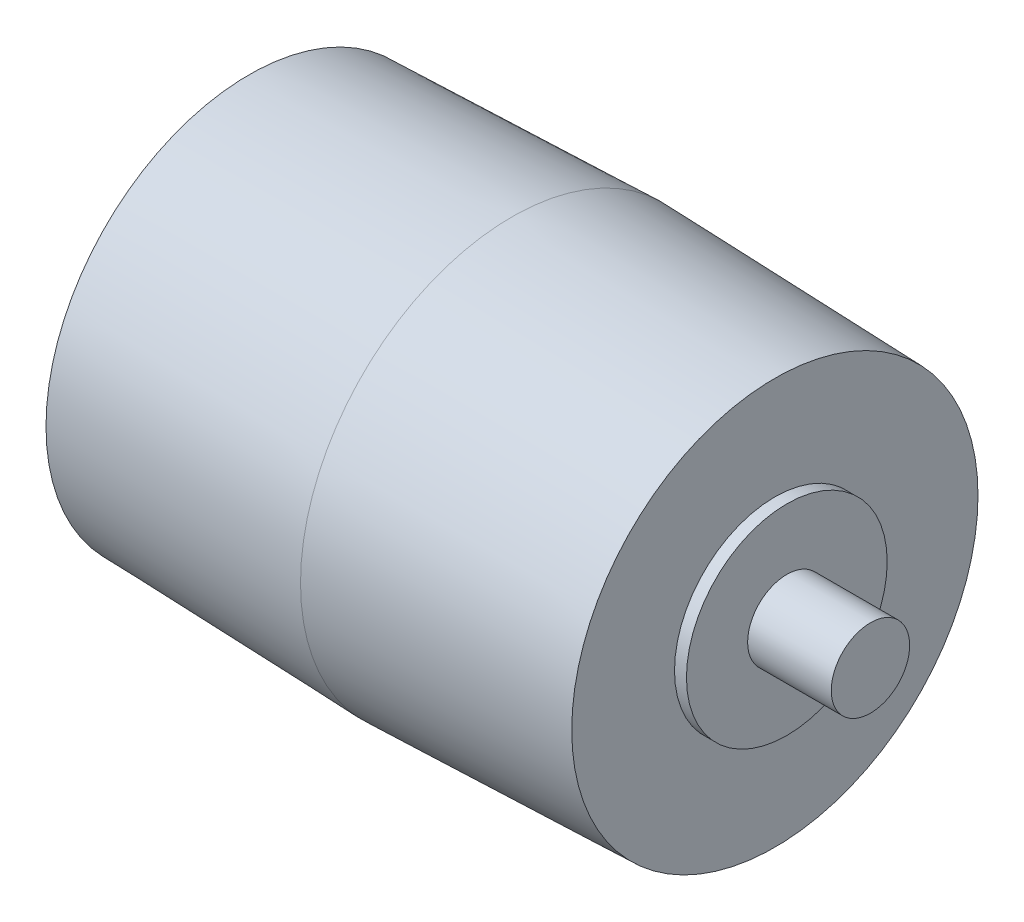
ISO-10303-21;
HEADER;
FILE_DESCRIPTION(('STEP AP214'),'2;1');
FILE_NAME('part.step','',(''),(''),'','','');
FILE_SCHEMA(('AUTOMOTIVE_DESIGN { 1 0 10303 214 1 1 1 1 }'));
ENDSEC;
DATA;
#1=APPLICATION_CONTEXT('core data for automotive mechanical design processes');
#2=APPLICATION_PROTOCOL_DEFINITION('international standard','automotive_design',2000,#1);
#3=PRODUCT_CONTEXT('',#1,'mechanical');
#4=PRODUCT('Part','Part','',(#3));
#5=PRODUCT_RELATED_PRODUCT_CATEGORY('part','',(#4));
#6=PRODUCT_DEFINITION_FORMATION('','',#4);
#7=PRODUCT_DEFINITION_CONTEXT('part definition',#1,'design');
#8=PRODUCT_DEFINITION('design','',#6,#7);
#9=PRODUCT_DEFINITION_SHAPE('','',#8);
#10=(LENGTH_UNIT() NAMED_UNIT(*) SI_UNIT(.MILLI.,.METRE.));
#11=(NAMED_UNIT(*) PLANE_ANGLE_UNIT() SI_UNIT($,.RADIAN.));
#12=(NAMED_UNIT(*) SI_UNIT($,.STERADIAN.) SOLID_ANGLE_UNIT());
#13=UNCERTAINTY_MEASURE_WITH_UNIT(LENGTH_MEASURE(1.E-05),#10,'distance_accuracy_value','');
#14=(GEOMETRIC_REPRESENTATION_CONTEXT(3) GLOBAL_UNCERTAINTY_ASSIGNED_CONTEXT((#13)) GLOBAL_UNIT_ASSIGNED_CONTEXT((#10,
#11,#12)) REPRESENTATION_CONTEXT('',''));
#15=CARTESIAN_POINT('',(0.,0.,0.));
#16=DIRECTION('',(0.,0.,1.));
#17=DIRECTION('',(1.,0.,0.));
#18=AXIS2_PLACEMENT_3D('',#15,#16,#17);
#19=CARTESIAN_POINT('',(9.525,0.,0.));
#20=DIRECTION('',(-1.,0.,0.));
#21=DIRECTION('',(0.,0.,1.));
#22=AXIS2_PLACEMENT_3D('',#19,#20,#21);
#23=PLANE('',#22);
#24=CARTESIAN_POINT('',(9.525,0.,0.));
#25=DIRECTION('',(-1.,0.,0.));
#26=DIRECTION('',(0.,0.,1.));
#27=AXIS2_PLACEMENT_3D('',#24,#25,#26);
#28=CIRCLE('',#27,1.0414);
#29=CARTESIAN_POINT('',(9.525,0.,1.0414));
#30=VERTEX_POINT('',#29);
#31=EDGE_CURVE('E10',#30,#30,#28,.T.);
#32=ORIENTED_EDGE('',*,*,#31,.F.);
#33=EDGE_LOOP('',(#32));
#34=FACE_BOUND('',#33,.T.);
#35=ADVANCED_FACE('F37',(#34),#23,.F.);
#36=CARTESIAN_POINT('',(-9.525,0.,0.));
#37=DIRECTION('',(-1.,0.,0.));
#38=DIRECTION('',(0.,0.,1.));
#39=AXIS2_PLACEMENT_3D('',#36,#37,#38);
#40=CYLINDRICAL_SURFACE('',#39,1.0414);
#41=CARTESIAN_POINT('',(7.3025,0.,0.));
#42=DIRECTION('',(-1.,0.,0.));
#43=DIRECTION('',(0.,0.,1.));
#44=AXIS2_PLACEMENT_3D('',#41,#42,#43);
#45=CIRCLE('',#44,1.0414);
#46=CARTESIAN_POINT('',(7.3025,0.,1.0414));
#47=VERTEX_POINT('',#46);
#48=EDGE_CURVE('E43',#47,#47,#45,.T.);
#49=ORIENTED_EDGE('',*,*,#48,.F.);
#50=EDGE_LOOP('',(#49));
#51=FACE_BOUND('',#50,.T.);
#52=ORIENTED_EDGE('',*,*,#31,.T.);
#53=EDGE_LOOP('',(#52));
#54=FACE_BOUND('',#53,.T.);
#55=ADVANCED_FACE('F130',(#51,#54),#40,.T.);
#56=CARTESIAN_POINT('',(7.3025,1.0414,0.));
#57=DIRECTION('',(-1.,0.,0.));
#58=DIRECTION('',(0.,0.,1.));
#59=AXIS2_PLACEMENT_3D('',#56,#57,#58);
#60=PLANE('',#59);
#61=CARTESIAN_POINT('',(7.3025,0.,0.));
#62=DIRECTION('',(-1.,0.,0.));
#63=DIRECTION('',(0.,0.,1.));
#64=AXIS2_PLACEMENT_3D('',#61,#62,#63);
#65=CIRCLE('',#64,2.667);
#66=CARTESIAN_POINT('',(7.3025,0.,2.667));
#67=VERTEX_POINT('',#66);
#68=EDGE_CURVE('E47',#67,#67,#65,.T.);
#69=ORIENTED_EDGE('',*,*,#68,.F.);
#70=EDGE_LOOP('',(#69));
#71=FACE_BOUND('',#70,.T.);
#72=ORIENTED_EDGE('',*,*,#48,.T.);
#73=EDGE_LOOP('',(#72));
#74=FACE_BOUND('',#73,.T.);
#75=ADVANCED_FACE('F125',(#71,#74),#60,.F.);
#76=CARTESIAN_POINT('',(-9.525,0.,0.));
#77=DIRECTION('',(-1.,0.,0.));
#78=DIRECTION('',(0.,0.,1.));
#79=AXIS2_PLACEMENT_3D('',#76,#77,#78);
#80=CYLINDRICAL_SURFACE('',#79,2.667);
#81=CARTESIAN_POINT('',(6.985,0.,0.));
#82=DIRECTION('',(-1.,0.,0.));
#83=DIRECTION('',(0.,0.,1.));
#84=AXIS2_PLACEMENT_3D('',#81,#82,#83);
#85=CIRCLE('',#84,2.667);
#86=CARTESIAN_POINT('',(6.985,0.,2.667));
#87=VERTEX_POINT('',#86);
#88=EDGE_CURVE('E51',#87,#87,#85,.T.);
#89=ORIENTED_EDGE('',*,*,#88,.F.);
#90=EDGE_LOOP('',(#89));
#91=FACE_BOUND('',#90,.T.);
#92=ORIENTED_EDGE('',*,*,#68,.T.);
#93=EDGE_LOOP('',(#92));
#94=FACE_BOUND('',#93,.T.);
#95=ADVANCED_FACE('F119',(#91,#94),#80,.T.);
#96=CARTESIAN_POINT('',(6.985,2.667,0.));
#97=DIRECTION('',(-1.,0.,0.));
#98=DIRECTION('',(0.,0.,1.));
#99=AXIS2_PLACEMENT_3D('',#96,#97,#98);
#100=PLANE('',#99);
#101=CARTESIAN_POINT('',(6.985,0.,0.));
#102=DIRECTION('',(-1.,0.,0.));
#103=DIRECTION('',(0.,0.,1.));
#104=AXIS2_PLACEMENT_3D('',#101,#102,#103);
#105=CIRCLE('',#104,5.3975);
#106=CARTESIAN_POINT('',(6.985,0.,5.3975));
#107=VERTEX_POINT('',#106);
#108=EDGE_CURVE('E56',#107,#107,#105,.T.);
#109=ORIENTED_EDGE('',*,*,#108,.F.);
#110=EDGE_LOOP('',(#109));
#111=FACE_BOUND('',#110,.T.);
#112=ORIENTED_EDGE('',*,*,#88,.T.);
#113=EDGE_LOOP('',(#112));
#114=FACE_BOUND('',#113,.T.);
#115=ADVANCED_FACE('F113',(#111,#114),#100,.F.);
#116=CARTESIAN_POINT('',(6.985,0.,0.));
#117=DIRECTION('',(-1.,0.,0.));
#118=DIRECTION('',(0.,0.,1.));
#119=AXIS2_PLACEMENT_3D('',#116,#117,#118);
#120=CONICAL_SURFACE('',#119,5.3975,0.031807450795163);
#121=CARTESIAN_POINT('',(0.,0.,0.));
#122=DIRECTION('',(-1.,0.,0.));
#123=DIRECTION('',(0.,0.,1.));
#124=AXIS2_PLACEMENT_3D('',#121,#122,#123);
#125=CIRCLE('',#124,5.61975);
#126=CARTESIAN_POINT('',(0.,0.,5.61975));
#127=VERTEX_POINT('',#126);
#128=EDGE_CURVE('E59',#127,#127,#125,.T.);
#129=ORIENTED_EDGE('',*,*,#128,.F.);
#130=EDGE_LOOP('',(#129));
#131=FACE_BOUND('',#130,.T.);
#132=ORIENTED_EDGE('',*,*,#108,.T.);
#133=EDGE_LOOP('',(#132));
#134=FACE_BOUND('',#133,.T.);
#135=ADVANCED_FACE('F107',(#131,#134),#120,.T.);
#136=CARTESIAN_POINT('',(0.,0.,0.));
#137=DIRECTION('',(1.,0.,0.));
#138=DIRECTION('',(0.,0.,-1.));
#139=AXIS2_PLACEMENT_3D('',#136,#137,#138);
#140=CONICAL_SURFACE('',#139,5.61975,0.0318074507951633);
#141=CARTESIAN_POINT('',(-6.985,0.,0.));
#142=DIRECTION('',(-1.,0.,0.));
#143=DIRECTION('',(0.,0.,1.));
#144=AXIS2_PLACEMENT_3D('',#141,#142,#143);
#145=CIRCLE('',#144,5.3975);
#146=CARTESIAN_POINT('',(-6.985,0.,5.3975));
#147=VERTEX_POINT('',#146);
#148=EDGE_CURVE('E62',#147,#147,#145,.T.);
#149=ORIENTED_EDGE('',*,*,#148,.F.);
#150=EDGE_LOOP('',(#149));
#151=FACE_BOUND('',#150,.T.);
#152=ORIENTED_EDGE('',*,*,#128,.T.);
#153=EDGE_LOOP('',(#152));
#154=FACE_BOUND('',#153,.T.);
#155=ADVANCED_FACE('F101',(#151,#154),#140,.T.);
#156=CARTESIAN_POINT('',(-6.985,2.667,0.));
#157=DIRECTION('',(1.,0.,0.));
#158=DIRECTION('',(0.,0.,-1.));
#159=AXIS2_PLACEMENT_3D('',#156,#157,#158);
#160=PLANE('',#159);
#161=CARTESIAN_POINT('',(-6.985,0.,0.));
#162=DIRECTION('',(-1.,0.,0.));
#163=DIRECTION('',(0.,0.,1.));
#164=AXIS2_PLACEMENT_3D('',#161,#162,#163);
#165=CIRCLE('',#164,2.667);
#166=CARTESIAN_POINT('',(-6.985,0.,2.667));
#167=VERTEX_POINT('',#166);
#168=EDGE_CURVE('E65',#167,#167,#165,.T.);
#169=ORIENTED_EDGE('',*,*,#168,.F.);
#170=EDGE_LOOP('',(#169));
#171=FACE_BOUND('',#170,.T.);
#172=ORIENTED_EDGE('',*,*,#148,.T.);
#173=EDGE_LOOP('',(#172));
#174=FACE_BOUND('',#173,.T.);
#175=ADVANCED_FACE('F95',(#171,#174),#160,.F.);
#176=CARTESIAN_POINT('',(-9.525,0.,0.));
#177=DIRECTION('',(-1.,0.,0.));
#178=DIRECTION('',(0.,0.,1.));
#179=AXIS2_PLACEMENT_3D('',#176,#177,#178);
#180=CYLINDRICAL_SURFACE('',#179,2.667);
#181=CARTESIAN_POINT('',(-7.3025,0.,0.));
#182=DIRECTION('',(-1.,0.,0.));
#183=DIRECTION('',(0.,0.,1.));
#184=AXIS2_PLACEMENT_3D('',#181,#182,#183);
#185=CIRCLE('',#184,2.667);
#186=CARTESIAN_POINT('',(-7.3025,0.,2.667));
#187=VERTEX_POINT('',#186);
#188=EDGE_CURVE('E68',#187,#187,#185,.T.);
#189=ORIENTED_EDGE('',*,*,#188,.F.);
#190=EDGE_LOOP('',(#189));
#191=FACE_BOUND('',#190,.T.);
#192=ORIENTED_EDGE('',*,*,#168,.T.);
#193=EDGE_LOOP('',(#192));
#194=FACE_BOUND('',#193,.T.);
#195=ADVANCED_FACE('F89',(#191,#194),#180,.T.);
#196=CARTESIAN_POINT('',(-7.3025,1.0414,0.));
#197=DIRECTION('',(1.,0.,0.));
#198=DIRECTION('',(0.,0.,-1.));
#199=AXIS2_PLACEMENT_3D('',#196,#197,#198);
#200=PLANE('',#199);
#201=CARTESIAN_POINT('',(-7.3025,0.,0.));
#202=DIRECTION('',(-1.,0.,0.));
#203=DIRECTION('',(0.,0.,1.));
#204=AXIS2_PLACEMENT_3D('',#201,#202,#203);
#205=CIRCLE('',#204,1.0414);
#206=CARTESIAN_POINT('',(-7.3025,0.,1.0414));
#207=VERTEX_POINT('',#206);
#208=EDGE_CURVE('E71',#207,#207,#205,.T.);
#209=ORIENTED_EDGE('',*,*,#208,.F.);
#210=EDGE_LOOP('',(#209));
#211=FACE_BOUND('',#210,.T.);
#212=ORIENTED_EDGE('',*,*,#188,.T.);
#213=EDGE_LOOP('',(#212));
#214=FACE_BOUND('',#213,.T.);
#215=ADVANCED_FACE('F83',(#211,#214),#200,.F.);
#216=CARTESIAN_POINT('',(-9.525,0.,0.));
#217=DIRECTION('',(-1.,0.,0.));
#218=DIRECTION('',(0.,0.,1.));
#219=AXIS2_PLACEMENT_3D('',#216,#217,#218);
#220=CYLINDRICAL_SURFACE('',#219,1.0414);
#221=CARTESIAN_POINT('',(-9.525,0.,0.));
#222=DIRECTION('',(-1.,0.,0.));
#223=DIRECTION('',(0.,0.,1.));
#224=AXIS2_PLACEMENT_3D('',#221,#222,#223);
#225=CIRCLE('',#224,1.0414);
#226=CARTESIAN_POINT('',(-9.525,0.,1.0414));
#227=VERTEX_POINT('',#226);
#228=EDGE_CURVE('E74',#227,#227,#225,.T.);
#229=ORIENTED_EDGE('',*,*,#228,.F.);
#230=EDGE_LOOP('',(#229));
#231=FACE_BOUND('',#230,.T.);
#232=ORIENTED_EDGE('',*,*,#208,.T.);
#233=EDGE_LOOP('',(#232));
#234=FACE_BOUND('',#233,.T.);
#235=ADVANCED_FACE('F80',(#231,#234),#220,.T.);
#236=CARTESIAN_POINT('',(-9.525,0.,0.));
#237=DIRECTION('',(1.,0.,0.));
#238=DIRECTION('',(0.,0.,-1.));
#239=AXIS2_PLACEMENT_3D('',#236,#237,#238);
#240=PLANE('',#239);
#241=ORIENTED_EDGE('',*,*,#228,.T.);
#242=EDGE_LOOP('',(#241));
#243=FACE_BOUND('',#242,.T.);
#244=ADVANCED_FACE('F78',(#243),#240,.F.);
#245=CLOSED_SHELL('',(#35,#55,#75,#95,#115,#135,#155,#175,#195,#215,#235,#244));
#246=MANIFOLD_SOLID_BREP('B2',#245);
#247=ADVANCED_BREP_SHAPE_REPRESENTATION('',(#18,#246),#14);
#248=SHAPE_DEFINITION_REPRESENTATION(#9,#247);
ENDSEC;
END-ISO-10303-21;
